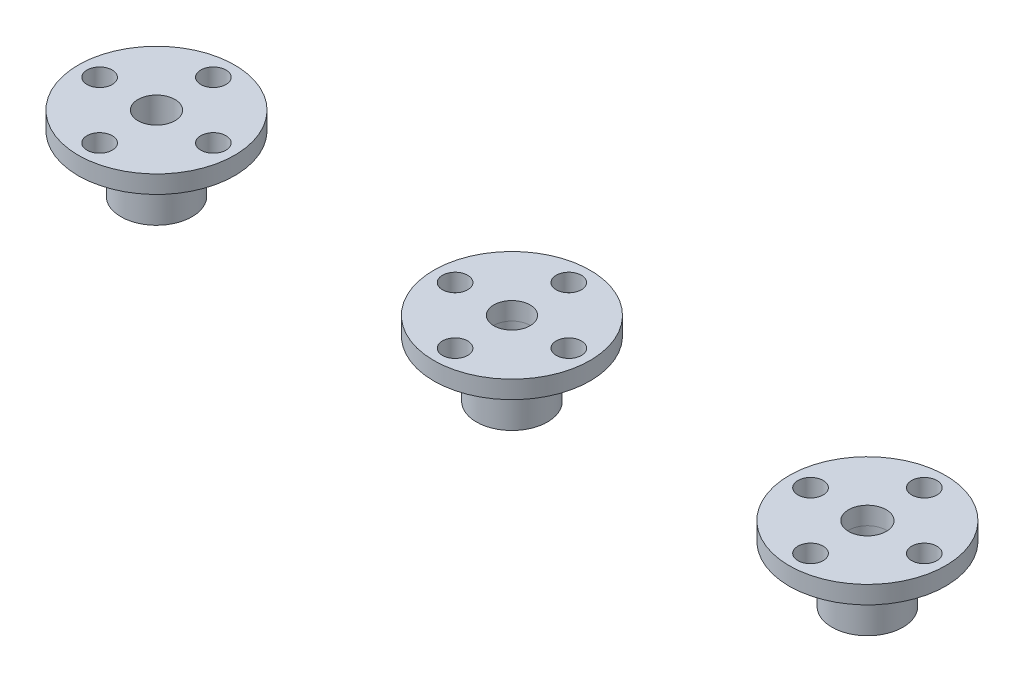
ISO-10303-21;
HEADER;
FILE_DESCRIPTION(('STEP AP214'),'2;1');
FILE_NAME('part.step','',(''),(''),'','','');
FILE_SCHEMA(('AUTOMOTIVE_DESIGN { 1 0 10303 214 1 1 1 1 }'));
ENDSEC;
DATA;
#1=APPLICATION_CONTEXT('core data for automotive mechanical design processes');
#2=APPLICATION_PROTOCOL_DEFINITION('international standard','automotive_design',2000,#1);
#3=PRODUCT_CONTEXT('',#1,'mechanical');
#4=PRODUCT('Part','Part','',(#3));
#5=PRODUCT_RELATED_PRODUCT_CATEGORY('part','',(#4));
#6=PRODUCT_DEFINITION_FORMATION('','',#4);
#7=PRODUCT_DEFINITION_CONTEXT('part definition',#1,'design');
#8=PRODUCT_DEFINITION('design','',#6,#7);
#9=PRODUCT_DEFINITION_SHAPE('','',#8);
#10=(LENGTH_UNIT() NAMED_UNIT(*) SI_UNIT(.MILLI.,.METRE.));
#11=(NAMED_UNIT(*) PLANE_ANGLE_UNIT() SI_UNIT($,.RADIAN.));
#12=(NAMED_UNIT(*) SI_UNIT($,.STERADIAN.) SOLID_ANGLE_UNIT());
#13=UNCERTAINTY_MEASURE_WITH_UNIT(LENGTH_MEASURE(1.E-05),#10,'distance_accuracy_value','');
#14=(GEOMETRIC_REPRESENTATION_CONTEXT(3) GLOBAL_UNCERTAINTY_ASSIGNED_CONTEXT((#13)) GLOBAL_UNIT_ASSIGNED_CONTEXT((#10,
#11,#12)) REPRESENTATION_CONTEXT('',''));
#15=CARTESIAN_POINT('',(0.,0.,0.));
#16=DIRECTION('',(0.,0.,1.));
#17=DIRECTION('',(1.,0.,0.));
#18=AXIS2_PLACEMENT_3D('',#15,#16,#17);
#19=CARTESIAN_POINT('',(50.,10.5,0.));
#20=DIRECTION('',(0.,1.,0.));
#21=DIRECTION('',(0.,0.,1.));
#22=AXIS2_PLACEMENT_3D('',#19,#20,#21);
#23=PLANE('',#22);
#24=CARTESIAN_POINT('',(50.0000000000002,10.5,8.));
#25=DIRECTION('',(0.,1.,0.));
#26=DIRECTION('',(0.,0.,1.));
#27=AXIS2_PLACEMENT_3D('',#24,#25,#26);
#28=CIRCLE('',#27,1.77500000000001);
#29=CARTESIAN_POINT('',(50.0000000000002,10.5,9.77500000000001));
#30=VERTEX_POINT('',#29);
#31=EDGE_CURVE('E74',#30,#30,#28,.T.);
#32=ORIENTED_EDGE('',*,*,#31,.F.);
#33=EDGE_LOOP('',(#32));
#34=FACE_BOUND('',#33,.T.);
#35=CARTESIAN_POINT('',(50.,10.5,-8.));
#36=DIRECTION('',(0.,1.,0.));
#37=DIRECTION('',(0.,0.,1.));
#38=AXIS2_PLACEMENT_3D('',#35,#36,#37);
#39=CIRCLE('',#38,1.775);
#40=CARTESIAN_POINT('',(50.,10.5,-6.225));
#41=VERTEX_POINT('',#40);
#42=EDGE_CURVE('E62',#41,#41,#39,.T.);
#43=ORIENTED_EDGE('',*,*,#42,.F.);
#44=EDGE_LOOP('',(#43));
#45=FACE_BOUND('',#44,.T.);
#46=CARTESIAN_POINT('',(50.,10.5,0.));
#47=DIRECTION('',(0.,1.,0.));
#48=DIRECTION('',(0.,0.,1.));
#49=AXIS2_PLACEMENT_3D('',#46,#47,#48);
#50=CIRCLE('',#49,11.);
#51=CARTESIAN_POINT('',(50.,10.5,11.));
#52=VERTEX_POINT('',#51);
#53=EDGE_CURVE('E11',#52,#52,#50,.T.);
#54=ORIENTED_EDGE('',*,*,#53,.T.);
#55=EDGE_LOOP('',(#54));
#56=FACE_BOUND('',#55,.T.);
#57=CARTESIAN_POINT('',(50.,10.5,0.));
#58=DIRECTION('',(0.,1.,0.));
#59=DIRECTION('',(0.,0.,1.));
#60=AXIS2_PLACEMENT_3D('',#57,#58,#59);
#61=CIRCLE('',#60,2.65);
#62=CARTESIAN_POINT('',(50.,10.5,2.65));
#63=VERTEX_POINT('',#62);
#64=EDGE_CURVE('E57',#63,#63,#61,.T.);
#65=ORIENTED_EDGE('',*,*,#64,.F.);
#66=EDGE_LOOP('',(#65));
#67=FACE_BOUND('',#66,.T.);
#68=CARTESIAN_POINT('',(58.0000000000001,10.5,0.));
#69=DIRECTION('',(0.,1.,0.));
#70=DIRECTION('',(0.,0.,1.));
#71=AXIS2_PLACEMENT_3D('',#68,#69,#70);
#72=CIRCLE('',#71,1.775);
#73=CARTESIAN_POINT('',(58.0000000000001,10.5,1.77499999999992));
#74=VERTEX_POINT('',#73);
#75=EDGE_CURVE('E68',#74,#74,#72,.T.);
#76=ORIENTED_EDGE('',*,*,#75,.F.);
#77=EDGE_LOOP('',(#76));
#78=FACE_BOUND('',#77,.T.);
#79=CARTESIAN_POINT('',(42.0000000000001,10.5,0.));
#80=DIRECTION('',(0.,1.,0.));
#81=DIRECTION('',(0.,0.,1.));
#82=AXIS2_PLACEMENT_3D('',#79,#80,#81);
#83=CIRCLE('',#82,1.775);
#84=CARTESIAN_POINT('',(42.0000000000001,10.5,1.77500000000003));
#85=VERTEX_POINT('',#84);
#86=EDGE_CURVE('E80',#85,#85,#83,.T.);
#87=ORIENTED_EDGE('',*,*,#86,.F.);
#88=EDGE_LOOP('',(#87));
#89=FACE_BOUND('',#88,.T.);
#90=ADVANCED_FACE('F46',(#34,#45,#56,#67,#78,#89),#23,.T.);
#91=CARTESIAN_POINT('',(50.,8.,0.));
#92=DIRECTION('',(0.,1.,0.));
#93=DIRECTION('',(0.,0.,1.));
#94=AXIS2_PLACEMENT_3D('',#91,#92,#93);
#95=PLANE('',#94);
#96=CARTESIAN_POINT('',(50.,8.,0.));
#97=DIRECTION('',(0.,1.,0.));
#98=DIRECTION('',(0.,0.,1.));
#99=AXIS2_PLACEMENT_3D('',#96,#97,#98);
#100=CIRCLE('',#99,11.);
#101=CARTESIAN_POINT('',(50.,8.,11.));
#102=VERTEX_POINT('',#101);
#103=EDGE_CURVE('E50',#102,#102,#100,.T.);
#104=ORIENTED_EDGE('',*,*,#103,.F.);
#105=EDGE_LOOP('',(#104));
#106=FACE_BOUND('',#105,.T.);
#107=CARTESIAN_POINT('',(50.,8.,0.));
#108=DIRECTION('',(0.,1.,0.));
#109=DIRECTION('',(0.,0.,1.));
#110=AXIS2_PLACEMENT_3D('',#107,#108,#109);
#111=CIRCLE('',#110,2.65);
#112=CARTESIAN_POINT('',(50.,8.,2.65));
#113=VERTEX_POINT('',#112);
#114=EDGE_CURVE('E59',#113,#113,#111,.T.);
#115=ORIENTED_EDGE('',*,*,#114,.T.);
#116=EDGE_LOOP('',(#115));
#117=FACE_BOUND('',#116,.T.);
#118=CARTESIAN_POINT('',(50.,8.,-8.));
#119=DIRECTION('',(0.,1.,0.));
#120=DIRECTION('',(0.,0.,1.));
#121=AXIS2_PLACEMENT_3D('',#118,#119,#120);
#122=CIRCLE('',#121,1.775);
#123=CARTESIAN_POINT('',(50.,8.,-6.225));
#124=VERTEX_POINT('',#123);
#125=EDGE_CURVE('E65',#124,#124,#122,.T.);
#126=ORIENTED_EDGE('',*,*,#125,.T.);
#127=EDGE_LOOP('',(#126));
#128=FACE_BOUND('',#127,.T.);
#129=CARTESIAN_POINT('',(58.0000000000001,8.,0.));
#130=DIRECTION('',(0.,1.,0.));
#131=DIRECTION('',(0.,0.,1.));
#132=AXIS2_PLACEMENT_3D('',#129,#130,#131);
#133=CIRCLE('',#132,1.775);
#134=CARTESIAN_POINT('',(58.0000000000001,8.,1.77499999999992));
#135=VERTEX_POINT('',#134);
#136=EDGE_CURVE('E71',#135,#135,#133,.T.);
#137=ORIENTED_EDGE('',*,*,#136,.T.);
#138=EDGE_LOOP('',(#137));
#139=FACE_BOUND('',#138,.T.);
#140=CARTESIAN_POINT('',(50.0000000000002,8.,8.));
#141=DIRECTION('',(0.,1.,0.));
#142=DIRECTION('',(0.,0.,1.));
#143=AXIS2_PLACEMENT_3D('',#140,#141,#142);
#144=CIRCLE('',#143,1.77500000000001);
#145=CARTESIAN_POINT('',(50.0000000000002,8.,9.77500000000001));
#146=VERTEX_POINT('',#145);
#147=EDGE_CURVE('E77',#146,#146,#144,.T.);
#148=ORIENTED_EDGE('',*,*,#147,.T.);
#149=EDGE_LOOP('',(#148));
#150=FACE_BOUND('',#149,.T.);
#151=CARTESIAN_POINT('',(42.0000000000001,8.,0.));
#152=DIRECTION('',(0.,1.,0.));
#153=DIRECTION('',(0.,0.,1.));
#154=AXIS2_PLACEMENT_3D('',#151,#152,#153);
#155=CIRCLE('',#154,1.775);
#156=CARTESIAN_POINT('',(42.0000000000001,8.,1.77500000000003));
#157=VERTEX_POINT('',#156);
#158=EDGE_CURVE('E83',#157,#157,#155,.T.);
#159=ORIENTED_EDGE('',*,*,#158,.T.);
#160=EDGE_LOOP('',(#159));
#161=FACE_BOUND('',#160,.T.);
#162=ADVANCED_FACE('F93',(#106,#117,#128,#139,#150,#161),#95,.F.);
#163=CARTESIAN_POINT('',(50.,10.5,0.));
#164=DIRECTION('',(0.,-1.,0.));
#165=DIRECTION('',(0.,0.,-1.));
#166=AXIS2_PLACEMENT_3D('',#163,#164,#165);
#167=CYLINDRICAL_SURFACE('',#166,11.);
#168=ORIENTED_EDGE('',*,*,#53,.F.);
#169=EDGE_LOOP('',(#168));
#170=FACE_BOUND('',#169,.T.);
#171=ORIENTED_EDGE('',*,*,#103,.T.);
#172=EDGE_LOOP('',(#171));
#173=FACE_BOUND('',#172,.T.);
#174=ADVANCED_FACE('F48',(#170,#173),#167,.T.);
#175=CARTESIAN_POINT('',(50.,10.5,0.));
#176=DIRECTION('',(0.,-1.,0.));
#177=DIRECTION('',(0.,0.,-1.));
#178=AXIS2_PLACEMENT_3D('',#175,#176,#177);
#179=CYLINDRICAL_SURFACE('',#178,2.65);
#180=ORIENTED_EDGE('',*,*,#64,.T.);
#181=EDGE_LOOP('',(#180));
#182=FACE_BOUND('',#181,.T.);
#183=ORIENTED_EDGE('',*,*,#114,.F.);
#184=EDGE_LOOP('',(#183));
#185=FACE_BOUND('',#184,.T.);
#186=ADVANCED_FACE('F103',(#182,#185),#179,.F.);
#187=CARTESIAN_POINT('',(50.,10.5,-8.));
#188=DIRECTION('',(0.,-1.,0.));
#189=DIRECTION('',(0.,0.,-1.));
#190=AXIS2_PLACEMENT_3D('',#187,#188,#189);
#191=CYLINDRICAL_SURFACE('',#190,1.775);
#192=ORIENTED_EDGE('',*,*,#42,.T.);
#193=EDGE_LOOP('',(#192));
#194=FACE_BOUND('',#193,.T.);
#195=ORIENTED_EDGE('',*,*,#125,.F.);
#196=EDGE_LOOP('',(#195));
#197=FACE_BOUND('',#196,.T.);
#198=ADVANCED_FACE('F106',(#194,#197),#191,.F.);
#199=CARTESIAN_POINT('',(58.0000000000001,10.5,0.));
#200=DIRECTION('',(0.,-1.,0.));
#201=DIRECTION('',(0.,0.,-1.));
#202=AXIS2_PLACEMENT_3D('',#199,#200,#201);
#203=CYLINDRICAL_SURFACE('',#202,1.775);
#204=ORIENTED_EDGE('',*,*,#75,.T.);
#205=EDGE_LOOP('',(#204));
#206=FACE_BOUND('',#205,.T.);
#207=ORIENTED_EDGE('',*,*,#136,.F.);
#208=EDGE_LOOP('',(#207));
#209=FACE_BOUND('',#208,.T.);
#210=ADVANCED_FACE('F110',(#206,#209),#203,.F.);
#211=CARTESIAN_POINT('',(50.0000000000002,10.5,8.));
#212=DIRECTION('',(0.,-1.,0.));
#213=DIRECTION('',(0.,0.,-1.));
#214=AXIS2_PLACEMENT_3D('',#211,#212,#213);
#215=CYLINDRICAL_SURFACE('',#214,1.77500000000001);
#216=ORIENTED_EDGE('',*,*,#31,.T.);
#217=EDGE_LOOP('',(#216));
#218=FACE_BOUND('',#217,.T.);
#219=ORIENTED_EDGE('',*,*,#147,.F.);
#220=EDGE_LOOP('',(#219));
#221=FACE_BOUND('',#220,.T.);
#222=ADVANCED_FACE('F114',(#218,#221),#215,.F.);
#223=CARTESIAN_POINT('',(42.0000000000001,10.5,0.));
#224=DIRECTION('',(0.,-1.,0.));
#225=DIRECTION('',(0.,0.,-1.));
#226=AXIS2_PLACEMENT_3D('',#223,#224,#225);
#227=CYLINDRICAL_SURFACE('',#226,1.775);
#228=ORIENTED_EDGE('',*,*,#86,.T.);
#229=EDGE_LOOP('',(#228));
#230=FACE_BOUND('',#229,.T.);
#231=ORIENTED_EDGE('',*,*,#158,.F.);
#232=EDGE_LOOP('',(#231));
#233=FACE_BOUND('',#232,.T.);
#234=ADVANCED_FACE('F89',(#230,#233),#227,.F.);
#235=CLOSED_SHELL('',(#90,#162,#174,#186,#198,#210,#222,#234));
#236=MANIFOLD_SOLID_BREP('B2',#235);
#237=CARTESIAN_POINT('',(0.,10.5,0.));
#238=DIRECTION('',(0.,1.,0.));
#239=DIRECTION('',(0.,0.,1.));
#240=AXIS2_PLACEMENT_3D('',#237,#238,#239);
#241=PLANE('',#240);
#242=CARTESIAN_POINT('',(4.51808198568511E-13,10.5,8.));
#243=DIRECTION('',(0.,1.,0.));
#244=DIRECTION('',(0.,0.,1.));
#245=AXIS2_PLACEMENT_3D('',#242,#243,#244);
#246=CIRCLE('',#245,1.77500000000049);
#247=CARTESIAN_POINT('',(4.51808198568511E-13,10.5,9.77500000000049));
#248=VERTEX_POINT('',#247);
#249=EDGE_CURVE('E228',#248,#248,#246,.T.);
#250=ORIENTED_EDGE('',*,*,#249,.F.);
#251=EDGE_LOOP('',(#250));
#252=FACE_BOUND('',#251,.T.);
#253=CARTESIAN_POINT('',(0.,10.5,-8.));
#254=DIRECTION('',(0.,1.,0.));
#255=DIRECTION('',(0.,0.,1.));
#256=AXIS2_PLACEMENT_3D('',#253,#254,#255);
#257=CIRCLE('',#256,1.775);
#258=CARTESIAN_POINT('',(0.,10.5,-6.225));
#259=VERTEX_POINT('',#258);
#260=EDGE_CURVE('E216',#259,#259,#257,.T.);
#261=ORIENTED_EDGE('',*,*,#260,.F.);
#262=EDGE_LOOP('',(#261));
#263=FACE_BOUND('',#262,.T.);
#264=CARTESIAN_POINT('',(0.,10.5,0.));
#265=DIRECTION('',(0.,1.,0.));
#266=DIRECTION('',(0.,0.,1.));
#267=AXIS2_PLACEMENT_3D('',#264,#265,#266);
#268=CIRCLE('',#267,11.);
#269=CARTESIAN_POINT('',(0.,10.5,11.));
#270=VERTEX_POINT('',#269);
#271=EDGE_CURVE('E45',#270,#270,#268,.T.);
#272=ORIENTED_EDGE('',*,*,#271,.T.);
#273=EDGE_LOOP('',(#272));
#274=FACE_BOUND('',#273,.T.);
#275=CARTESIAN_POINT('',(0.,10.5,0.));
#276=DIRECTION('',(0.,1.,0.));
#277=DIRECTION('',(0.,0.,1.));
#278=AXIS2_PLACEMENT_3D('',#275,#276,#277);
#279=CIRCLE('',#278,2.55);
#280=CARTESIAN_POINT('',(0.,10.5,2.55));
#281=VERTEX_POINT('',#280);
#282=EDGE_CURVE('E211',#281,#281,#279,.T.);
#283=ORIENTED_EDGE('',*,*,#282,.F.);
#284=EDGE_LOOP('',(#283));
#285=FACE_BOUND('',#284,.T.);
#286=CARTESIAN_POINT('',(8.00000000000023,10.5,-2.25904099284255E-13));
#287=DIRECTION('',(0.,1.,0.));
#288=DIRECTION('',(0.,0.,1.));
#289=AXIS2_PLACEMENT_3D('',#286,#287,#288);
#290=CIRCLE('',#289,1.77500000000018);
#291=CARTESIAN_POINT('',(8.00000000000023,10.5,1.77499999999995));
#292=VERTEX_POINT('',#291);
#293=EDGE_CURVE('E222',#292,#292,#290,.T.);
#294=ORIENTED_EDGE('',*,*,#293,.F.);
#295=EDGE_LOOP('',(#294));
#296=FACE_BOUND('',#295,.T.);
#297=CARTESIAN_POINT('',(-7.99999999999977,10.5,2.26883816723573E-13));
#298=DIRECTION('',(0.,1.,0.));
#299=DIRECTION('',(0.,0.,1.));
#300=AXIS2_PLACEMENT_3D('',#297,#298,#299);
#301=CIRCLE('',#300,1.77500000000036);
#302=CARTESIAN_POINT('',(-7.99999999999977,10.5,1.77500000000059));
#303=VERTEX_POINT('',#302);
#304=EDGE_CURVE('E234',#303,#303,#301,.T.);
#305=ORIENTED_EDGE('',*,*,#304,.F.);
#306=EDGE_LOOP('',(#305));
#307=FACE_BOUND('',#306,.T.);
#308=ADVANCED_FACE('F200',(#252,#263,#274,#285,#296,#307),#241,.T.);
#309=CARTESIAN_POINT('',(0.,8.,0.));
#310=DIRECTION('',(0.,1.,0.));
#311=DIRECTION('',(0.,0.,1.));
#312=AXIS2_PLACEMENT_3D('',#309,#310,#311);
#313=PLANE('',#312);
#314=CARTESIAN_POINT('',(0.,8.,0.));
#315=DIRECTION('',(0.,1.,0.));
#316=DIRECTION('',(0.,0.,1.));
#317=AXIS2_PLACEMENT_3D('',#314,#315,#316);
#318=CIRCLE('',#317,11.);
#319=CARTESIAN_POINT('',(0.,8.,11.));
#320=VERTEX_POINT('',#319);
#321=EDGE_CURVE('E204',#320,#320,#318,.T.);
#322=ORIENTED_EDGE('',*,*,#321,.F.);
#323=EDGE_LOOP('',(#322));
#324=FACE_BOUND('',#323,.T.);
#325=CARTESIAN_POINT('',(0.,8.,0.));
#326=DIRECTION('',(0.,1.,0.));
#327=DIRECTION('',(0.,0.,1.));
#328=AXIS2_PLACEMENT_3D('',#325,#326,#327);
#329=CIRCLE('',#328,2.55);
#330=CARTESIAN_POINT('',(0.,8.,2.55));
#331=VERTEX_POINT('',#330);
#332=EDGE_CURVE('E213',#331,#331,#329,.T.);
#333=ORIENTED_EDGE('',*,*,#332,.T.);
#334=EDGE_LOOP('',(#333));
#335=FACE_BOUND('',#334,.T.);
#336=CARTESIAN_POINT('',(0.,8.,-8.));
#337=DIRECTION('',(0.,1.,0.));
#338=DIRECTION('',(0.,0.,1.));
#339=AXIS2_PLACEMENT_3D('',#336,#337,#338);
#340=CIRCLE('',#339,1.775);
#341=CARTESIAN_POINT('',(0.,8.,-6.225));
#342=VERTEX_POINT('',#341);
#343=EDGE_CURVE('E219',#342,#342,#340,.T.);
#344=ORIENTED_EDGE('',*,*,#343,.T.);
#345=EDGE_LOOP('',(#344));
#346=FACE_BOUND('',#345,.T.);
#347=CARTESIAN_POINT('',(8.00000000000023,8.,-2.25904099284255E-13));
#348=DIRECTION('',(0.,1.,0.));
#349=DIRECTION('',(0.,0.,1.));
#350=AXIS2_PLACEMENT_3D('',#347,#348,#349);
#351=CIRCLE('',#350,1.77500000000018);
#352=CARTESIAN_POINT('',(8.00000000000023,8.,1.77499999999995));
#353=VERTEX_POINT('',#352);
#354=EDGE_CURVE('E225',#353,#353,#351,.T.);
#355=ORIENTED_EDGE('',*,*,#354,.T.);
#356=EDGE_LOOP('',(#355));
#357=FACE_BOUND('',#356,.T.);
#358=CARTESIAN_POINT('',(4.51808198568511E-13,8.,8.));
#359=DIRECTION('',(0.,1.,0.));
#360=DIRECTION('',(0.,0.,1.));
#361=AXIS2_PLACEMENT_3D('',#358,#359,#360);
#362=CIRCLE('',#361,1.77500000000049);
#363=CARTESIAN_POINT('',(4.51808198568511E-13,8.,9.77500000000049));
#364=VERTEX_POINT('',#363);
#365=EDGE_CURVE('E231',#364,#364,#362,.T.);
#366=ORIENTED_EDGE('',*,*,#365,.T.);
#367=EDGE_LOOP('',(#366));
#368=FACE_BOUND('',#367,.T.);
#369=CARTESIAN_POINT('',(-7.99999999999977,8.,2.26883816723573E-13));
#370=DIRECTION('',(0.,1.,0.));
#371=DIRECTION('',(0.,0.,1.));
#372=AXIS2_PLACEMENT_3D('',#369,#370,#371);
#373=CIRCLE('',#372,1.77500000000036);
#374=CARTESIAN_POINT('',(-7.99999999999977,8.,1.77500000000059));
#375=VERTEX_POINT('',#374);
#376=EDGE_CURVE('E237',#375,#375,#373,.T.);
#377=ORIENTED_EDGE('',*,*,#376,.T.);
#378=EDGE_LOOP('',(#377));
#379=FACE_BOUND('',#378,.T.);
#380=ADVANCED_FACE('F247',(#324,#335,#346,#357,#368,#379),#313,.F.);
#381=CARTESIAN_POINT('',(0.,10.5,0.));
#382=DIRECTION('',(0.,-1.,0.));
#383=DIRECTION('',(0.,0.,-1.));
#384=AXIS2_PLACEMENT_3D('',#381,#382,#383);
#385=CYLINDRICAL_SURFACE('',#384,11.);
#386=ORIENTED_EDGE('',*,*,#271,.F.);
#387=EDGE_LOOP('',(#386));
#388=FACE_BOUND('',#387,.T.);
#389=ORIENTED_EDGE('',*,*,#321,.T.);
#390=EDGE_LOOP('',(#389));
#391=FACE_BOUND('',#390,.T.);
#392=ADVANCED_FACE('F202',(#388,#391),#385,.T.);
#393=CARTESIAN_POINT('',(0.,10.5,0.));
#394=DIRECTION('',(0.,-1.,0.));
#395=DIRECTION('',(0.,0.,-1.));
#396=AXIS2_PLACEMENT_3D('',#393,#394,#395);
#397=CYLINDRICAL_SURFACE('',#396,2.55);
#398=ORIENTED_EDGE('',*,*,#282,.T.);
#399=EDGE_LOOP('',(#398));
#400=FACE_BOUND('',#399,.T.);
#401=ORIENTED_EDGE('',*,*,#332,.F.);
#402=EDGE_LOOP('',(#401));
#403=FACE_BOUND('',#402,.T.);
#404=ADVANCED_FACE('F257',(#400,#403),#397,.F.);
#405=CARTESIAN_POINT('',(0.,10.5,-8.));
#406=DIRECTION('',(0.,-1.,0.));
#407=DIRECTION('',(0.,0.,-1.));
#408=AXIS2_PLACEMENT_3D('',#405,#406,#407);
#409=CYLINDRICAL_SURFACE('',#408,1.775);
#410=ORIENTED_EDGE('',*,*,#260,.T.);
#411=EDGE_LOOP('',(#410));
#412=FACE_BOUND('',#411,.T.);
#413=ORIENTED_EDGE('',*,*,#343,.F.);
#414=EDGE_LOOP('',(#413));
#415=FACE_BOUND('',#414,.T.);
#416=ADVANCED_FACE('F260',(#412,#415),#409,.F.);
#417=CARTESIAN_POINT('',(8.00000000000023,10.5,-2.25904099284255E-13));
#418=DIRECTION('',(0.,-1.,0.));
#419=DIRECTION('',(0.,0.,-1.));
#420=AXIS2_PLACEMENT_3D('',#417,#418,#419);
#421=CYLINDRICAL_SURFACE('',#420,1.77500000000018);
#422=ORIENTED_EDGE('',*,*,#293,.T.);
#423=EDGE_LOOP('',(#422));
#424=FACE_BOUND('',#423,.T.);
#425=ORIENTED_EDGE('',*,*,#354,.F.);
#426=EDGE_LOOP('',(#425));
#427=FACE_BOUND('',#426,.T.);
#428=ADVANCED_FACE('F264',(#424,#427),#421,.F.);
#429=CARTESIAN_POINT('',(4.51808198568511E-13,10.5,8.));
#430=DIRECTION('',(0.,-1.,0.));
#431=DIRECTION('',(0.,0.,-1.));
#432=AXIS2_PLACEMENT_3D('',#429,#430,#431);
#433=CYLINDRICAL_SURFACE('',#432,1.77500000000049);
#434=ORIENTED_EDGE('',*,*,#249,.T.);
#435=EDGE_LOOP('',(#434));
#436=FACE_BOUND('',#435,.T.);
#437=ORIENTED_EDGE('',*,*,#365,.F.);
#438=EDGE_LOOP('',(#437));
#439=FACE_BOUND('',#438,.T.);
#440=ADVANCED_FACE('F268',(#436,#439),#433,.F.);
#441=CARTESIAN_POINT('',(-7.99999999999977,10.5,2.26883816723573E-13));
#442=DIRECTION('',(0.,-1.,0.));
#443=DIRECTION('',(0.,0.,-1.));
#444=AXIS2_PLACEMENT_3D('',#441,#442,#443);
#445=CYLINDRICAL_SURFACE('',#444,1.77500000000036);
#446=ORIENTED_EDGE('',*,*,#304,.T.);
#447=EDGE_LOOP('',(#446));
#448=FACE_BOUND('',#447,.T.);
#449=ORIENTED_EDGE('',*,*,#376,.F.);
#450=EDGE_LOOP('',(#449));
#451=FACE_BOUND('',#450,.T.);
#452=ADVANCED_FACE('F243',(#448,#451),#445,.F.);
#453=CLOSED_SHELL('',(#308,#380,#392,#404,#416,#428,#440,#452));
#454=MANIFOLD_SOLID_BREP('B6',#453);
#455=CARTESIAN_POINT('',(50.,8.,0.));
#456=DIRECTION('',(0.,1.,0.));
#457=DIRECTION('',(0.,0.,1.));
#458=AXIS2_PLACEMENT_3D('',#455,#456,#457);
#459=PLANE('',#458);
#460=CARTESIAN_POINT('',(50.,8.,0.));
#461=DIRECTION('',(0.,1.,0.));
#462=DIRECTION('',(0.,0.,1.));
#463=AXIS2_PLACEMENT_3D('',#460,#461,#462);
#464=CIRCLE('',#463,5.);
#465=CARTESIAN_POINT('',(50.,8.,5.));
#466=VERTEX_POINT('',#465);
#467=EDGE_CURVE('E199',#466,#466,#464,.T.);
#468=ORIENTED_EDGE('',*,*,#467,.T.);
#469=EDGE_LOOP('',(#468));
#470=FACE_BOUND('',#469,.T.);
#471=CARTESIAN_POINT('',(50.,8.,0.));
#472=DIRECTION('',(0.,1.,0.));
#473=DIRECTION('',(0.,0.,1.));
#474=AXIS2_PLACEMENT_3D('',#471,#472,#473);
#475=CIRCLE('',#474,2.65);
#476=CARTESIAN_POINT('',(50.,8.,2.65));
#477=VERTEX_POINT('',#476);
#478=EDGE_CURVE('E365',#477,#477,#475,.T.);
#479=ORIENTED_EDGE('',*,*,#478,.F.);
#480=EDGE_LOOP('',(#479));
#481=FACE_BOUND('',#480,.T.);
#482=ADVANCED_FACE('F354',(#470,#481),#459,.T.);
#483=CARTESIAN_POINT('',(50.,0.,0.));
#484=DIRECTION('',(0.,1.,0.));
#485=DIRECTION('',(0.,0.,1.));
#486=AXIS2_PLACEMENT_3D('',#483,#484,#485);
#487=PLANE('',#486);
#488=CARTESIAN_POINT('',(50.,0.,0.));
#489=DIRECTION('',(0.,1.,0.));
#490=DIRECTION('',(0.,0.,1.));
#491=AXIS2_PLACEMENT_3D('',#488,#489,#490);
#492=CIRCLE('',#491,5.);
#493=CARTESIAN_POINT('',(50.,0.,5.));
#494=VERTEX_POINT('',#493);
#495=EDGE_CURVE('E358',#494,#494,#492,.T.);
#496=ORIENTED_EDGE('',*,*,#495,.F.);
#497=EDGE_LOOP('',(#496));
#498=FACE_BOUND('',#497,.T.);
#499=CARTESIAN_POINT('',(50.,0.,0.));
#500=DIRECTION('',(0.,1.,0.));
#501=DIRECTION('',(0.,0.,1.));
#502=AXIS2_PLACEMENT_3D('',#499,#500,#501);
#503=CIRCLE('',#502,2.65);
#504=CARTESIAN_POINT('',(50.,0.,2.65));
#505=VERTEX_POINT('',#504);
#506=EDGE_CURVE('E367',#505,#505,#503,.T.);
#507=ORIENTED_EDGE('',*,*,#506,.T.);
#508=EDGE_LOOP('',(#507));
#509=FACE_BOUND('',#508,.T.);
#510=ADVANCED_FACE('F377',(#498,#509),#487,.F.);
#511=CARTESIAN_POINT('',(50.,8.,0.));
#512=DIRECTION('',(0.,-1.,0.));
#513=DIRECTION('',(0.,0.,-1.));
#514=AXIS2_PLACEMENT_3D('',#511,#512,#513);
#515=CYLINDRICAL_SURFACE('',#514,5.);
#516=ORIENTED_EDGE('',*,*,#467,.F.);
#517=EDGE_LOOP('',(#516));
#518=FACE_BOUND('',#517,.T.);
#519=ORIENTED_EDGE('',*,*,#495,.T.);
#520=EDGE_LOOP('',(#519));
#521=FACE_BOUND('',#520,.T.);
#522=ADVANCED_FACE('F356',(#518,#521),#515,.T.);
#523=CARTESIAN_POINT('',(50.,8.,0.));
#524=DIRECTION('',(0.,-1.,0.));
#525=DIRECTION('',(0.,0.,-1.));
#526=AXIS2_PLACEMENT_3D('',#523,#524,#525);
#527=CYLINDRICAL_SURFACE('',#526,2.65);
#528=ORIENTED_EDGE('',*,*,#478,.T.);
#529=EDGE_LOOP('',(#528));
#530=FACE_BOUND('',#529,.T.);
#531=ORIENTED_EDGE('',*,*,#506,.F.);
#532=EDGE_LOOP('',(#531));
#533=FACE_BOUND('',#532,.T.);
#534=ADVANCED_FACE('F373',(#530,#533),#527,.F.);
#535=CLOSED_SHELL('',(#482,#510,#522,#534));
#536=MANIFOLD_SOLID_BREP('B40',#535);
#537=CARTESIAN_POINT('',(-50.,0.,0.));
#538=DIRECTION('',(0.,1.,0.));
#539=DIRECTION('',(0.,0.,1.));
#540=AXIS2_PLACEMENT_3D('',#537,#538,#539);
#541=PLANE('',#540);
#542=CARTESIAN_POINT('',(-50.,0.,0.));
#543=DIRECTION('',(0.,1.,0.));
#544=DIRECTION('',(0.,0.,1.));
#545=AXIS2_PLACEMENT_3D('',#542,#543,#544);
#546=CIRCLE('',#545,5.);
#547=CARTESIAN_POINT('',(-50.,0.,5.));
#548=VERTEX_POINT('',#547);
#549=EDGE_CURVE('E427',#548,#548,#546,.T.);
#550=ORIENTED_EDGE('',*,*,#549,.F.);
#551=EDGE_LOOP('',(#550));
#552=FACE_BOUND('',#551,.T.);
#553=CARTESIAN_POINT('',(-50.,0.,0.));
#554=DIRECTION('',(0.,1.,0.));
#555=DIRECTION('',(0.,0.,1.));
#556=AXIS2_PLACEMENT_3D('',#553,#554,#555);
#557=CIRCLE('',#556,2.6);
#558=CARTESIAN_POINT('',(-50.,0.,2.6));
#559=VERTEX_POINT('',#558);
#560=EDGE_CURVE('E436',#559,#559,#557,.T.);
#561=ORIENTED_EDGE('',*,*,#560,.T.);
#562=EDGE_LOOP('',(#561));
#563=FACE_BOUND('',#562,.T.);
#564=ADVANCED_FACE('F423',(#552,#563),#541,.F.);
#565=CARTESIAN_POINT('',(-50.,8.,0.));
#566=DIRECTION('',(0.,-1.,0.));
#567=DIRECTION('',(0.,0.,-1.));
#568=AXIS2_PLACEMENT_3D('',#565,#566,#567);
#569=CYLINDRICAL_SURFACE('',#568,5.);
#570=CARTESIAN_POINT('',(-50.,8.,0.));
#571=DIRECTION('',(0.,1.,0.));
#572=DIRECTION('',(0.,0.,1.));
#573=AXIS2_PLACEMENT_3D('',#570,#571,#572);
#574=CIRCLE('',#573,5.);
#575=CARTESIAN_POINT('',(-50.,8.,5.));
#576=VERTEX_POINT('',#575);
#577=EDGE_CURVE('E353',#576,#576,#574,.T.);
#578=ORIENTED_EDGE('',*,*,#577,.F.);
#579=EDGE_LOOP('',(#578));
#580=FACE_BOUND('',#579,.T.);
#581=ORIENTED_EDGE('',*,*,#549,.T.);
#582=EDGE_LOOP('',(#581));
#583=FACE_BOUND('',#582,.T.);
#584=ADVANCED_FACE('F425',(#580,#583),#569,.T.);
#585=CARTESIAN_POINT('',(-50.,8.,0.));
#586=DIRECTION('',(0.,-1.,0.));
#587=DIRECTION('',(0.,0.,-1.));
#588=AXIS2_PLACEMENT_3D('',#585,#586,#587);
#589=CYLINDRICAL_SURFACE('',#588,2.6);
#590=ORIENTED_EDGE('',*,*,#560,.F.);
#591=EDGE_LOOP('',(#590));
#592=FACE_BOUND('',#591,.T.);
#593=CARTESIAN_POINT('',(-50.,10.5,0.));
#594=DIRECTION('',(0.,1.,0.));
#595=DIRECTION('',(0.,0.,1.));
#596=AXIS2_PLACEMENT_3D('',#593,#594,#595);
#597=CIRCLE('',#596,2.6);
#598=CARTESIAN_POINT('',(-50.,10.5,2.6));
#599=VERTEX_POINT('',#598);
#600=EDGE_CURVE('E446',#599,#599,#597,.T.);
#601=ORIENTED_EDGE('',*,*,#600,.T.);
#602=EDGE_LOOP('',(#601));
#603=FACE_BOUND('',#602,.T.);
#604=ADVANCED_FACE('F492',(#592,#603),#589,.F.);
#605=CARTESIAN_POINT('',(-50.,10.5,0.));
#606=DIRECTION('',(0.,1.,0.));
#607=DIRECTION('',(0.,0.,1.));
#608=AXIS2_PLACEMENT_3D('',#605,#606,#607);
#609=PLANE('',#608);
#610=CARTESIAN_POINT('',(-50.,10.5,8.));
#611=DIRECTION('',(0.,1.,0.));
#612=DIRECTION('',(0.,0.,1.));
#613=AXIS2_PLACEMENT_3D('',#610,#611,#612);
#614=CIRCLE('',#613,1.775);
#615=CARTESIAN_POINT('',(-50.,10.5,9.775));
#616=VERTEX_POINT('',#615);
#617=EDGE_CURVE('E466',#616,#616,#614,.T.);
#618=ORIENTED_EDGE('',*,*,#617,.F.);
#619=EDGE_LOOP('',(#618));
#620=FACE_BOUND('',#619,.T.);
#621=CARTESIAN_POINT('',(-50.,10.5,-8.));
#622=DIRECTION('',(0.,1.,0.));
#623=DIRECTION('',(0.,0.,1.));
#624=AXIS2_PLACEMENT_3D('',#621,#622,#623);
#625=CIRCLE('',#624,1.775);
#626=CARTESIAN_POINT('',(-50.,10.5,-6.225));
#627=VERTEX_POINT('',#626);
#628=EDGE_CURVE('E453',#627,#627,#625,.T.);
#629=ORIENTED_EDGE('',*,*,#628,.F.);
#630=EDGE_LOOP('',(#629));
#631=FACE_BOUND('',#630,.T.);
#632=CARTESIAN_POINT('',(-50.,10.5,0.));
#633=DIRECTION('',(0.,1.,0.));
#634=DIRECTION('',(0.,0.,1.));
#635=AXIS2_PLACEMENT_3D('',#632,#633,#634);
#636=CIRCLE('',#635,11.);
#637=CARTESIAN_POINT('',(-50.,10.5,11.));
#638=VERTEX_POINT('',#637);
#639=EDGE_CURVE('E441',#638,#638,#636,.T.);
#640=ORIENTED_EDGE('',*,*,#639,.T.);
#641=EDGE_LOOP('',(#640));
#642=FACE_BOUND('',#641,.T.);
#643=ORIENTED_EDGE('',*,*,#600,.F.);
#644=EDGE_LOOP('',(#643));
#645=FACE_BOUND('',#644,.T.);
#646=CARTESIAN_POINT('',(-42.,10.5,0.));
#647=DIRECTION('',(0.,1.,0.));
#648=DIRECTION('',(0.,0.,1.));
#649=AXIS2_PLACEMENT_3D('',#646,#647,#648);
#650=CIRCLE('',#649,1.775);
#651=CARTESIAN_POINT('',(-42.,10.5,1.775));
#652=VERTEX_POINT('',#651);
#653=EDGE_CURVE('E458',#652,#652,#650,.T.);
#654=ORIENTED_EDGE('',*,*,#653,.F.);
#655=EDGE_LOOP('',(#654));
#656=FACE_BOUND('',#655,.T.);
#657=CARTESIAN_POINT('',(-58.,10.5,0.));
#658=DIRECTION('',(0.,1.,0.));
#659=DIRECTION('',(0.,0.,1.));
#660=AXIS2_PLACEMENT_3D('',#657,#658,#659);
#661=CIRCLE('',#660,1.775);
#662=CARTESIAN_POINT('',(-58.,10.5,1.775));
#663=VERTEX_POINT('',#662);
#664=EDGE_CURVE('E474',#663,#663,#661,.T.);
#665=ORIENTED_EDGE('',*,*,#664,.F.);
#666=EDGE_LOOP('',(#665));
#667=FACE_BOUND('',#666,.T.);
#668=ADVANCED_FACE('F489',(#620,#631,#642,#645,#656,#667),#609,.T.);
#669=CARTESIAN_POINT('',(-50.,8.,0.));
#670=DIRECTION('',(0.,1.,0.));
#671=DIRECTION('',(0.,0.,1.));
#672=AXIS2_PLACEMENT_3D('',#669,#670,#671);
#673=PLANE('',#672);
#674=ORIENTED_EDGE('',*,*,#577,.T.);
#675=EDGE_LOOP('',(#674));
#676=FACE_BOUND('',#675,.T.);
#677=CARTESIAN_POINT('',(-50.,8.,0.));
#678=DIRECTION('',(0.,1.,0.));
#679=DIRECTION('',(0.,0.,1.));
#680=AXIS2_PLACEMENT_3D('',#677,#678,#679);
#681=CIRCLE('',#680,11.);
#682=CARTESIAN_POINT('',(-50.,8.,11.));
#683=VERTEX_POINT('',#682);
#684=EDGE_CURVE('E442',#683,#683,#681,.T.);
#685=ORIENTED_EDGE('',*,*,#684,.F.);
#686=EDGE_LOOP('',(#685));
#687=FACE_BOUND('',#686,.T.);
#688=CARTESIAN_POINT('',(-50.,8.,-8.));
#689=DIRECTION('',(0.,1.,0.));
#690=DIRECTION('',(0.,0.,1.));
#691=AXIS2_PLACEMENT_3D('',#688,#689,#690);
#692=CIRCLE('',#691,1.775);
#693=CARTESIAN_POINT('',(-50.,8.,-6.225));
#694=VERTEX_POINT('',#693);
#695=EDGE_CURVE('E454',#694,#694,#692,.T.);
#696=ORIENTED_EDGE('',*,*,#695,.T.);
#697=EDGE_LOOP('',(#696));
#698=FACE_BOUND('',#697,.T.);
#699=CARTESIAN_POINT('',(-42.,8.,0.));
#700=DIRECTION('',(0.,1.,0.));
#701=DIRECTION('',(0.,0.,1.));
#702=AXIS2_PLACEMENT_3D('',#699,#700,#701);
#703=CIRCLE('',#702,1.775);
#704=CARTESIAN_POINT('',(-42.,8.,1.775));
#705=VERTEX_POINT('',#704);
#706=EDGE_CURVE('E462',#705,#705,#703,.T.);
#707=ORIENTED_EDGE('',*,*,#706,.T.);
#708=EDGE_LOOP('',(#707));
#709=FACE_BOUND('',#708,.T.);
#710=CARTESIAN_POINT('',(-50.,8.,8.));
#711=DIRECTION('',(0.,1.,0.));
#712=DIRECTION('',(0.,0.,1.));
#713=AXIS2_PLACEMENT_3D('',#710,#711,#712);
#714=CIRCLE('',#713,1.775);
#715=CARTESIAN_POINT('',(-50.,8.,9.775));
#716=VERTEX_POINT('',#715);
#717=EDGE_CURVE('E470',#716,#716,#714,.T.);
#718=ORIENTED_EDGE('',*,*,#717,.T.);
#719=EDGE_LOOP('',(#718));
#720=FACE_BOUND('',#719,.T.);
#721=CARTESIAN_POINT('',(-58.,8.,0.));
#722=DIRECTION('',(0.,1.,0.));
#723=DIRECTION('',(0.,0.,1.));
#724=AXIS2_PLACEMENT_3D('',#721,#722,#723);
#725=CIRCLE('',#724,1.775);
#726=CARTESIAN_POINT('',(-58.,8.,1.775));
#727=VERTEX_POINT('',#726);
#728=EDGE_CURVE('E478',#727,#727,#725,.T.);
#729=ORIENTED_EDGE('',*,*,#728,.T.);
#730=EDGE_LOOP('',(#729));
#731=FACE_BOUND('',#730,.T.);
#732=ADVANCED_FACE('F491',(#676,#687,#698,#709,#720,#731),#673,.F.);
#733=CARTESIAN_POINT('',(-50.,10.5,0.));
#734=DIRECTION('',(0.,-1.,0.));
#735=DIRECTION('',(0.,0.,-1.));
#736=AXIS2_PLACEMENT_3D('',#733,#734,#735);
#737=CYLINDRICAL_SURFACE('',#736,11.);
#738=ORIENTED_EDGE('',*,*,#639,.F.);
#739=EDGE_LOOP('',(#738));
#740=FACE_BOUND('',#739,.T.);
#741=ORIENTED_EDGE('',*,*,#684,.T.);
#742=EDGE_LOOP('',(#741));
#743=FACE_BOUND('',#742,.T.);
#744=ADVANCED_FACE('F499',(#740,#743),#737,.T.);
#745=CARTESIAN_POINT('',(-50.,10.5,-8.));
#746=DIRECTION('',(0.,-1.,0.));
#747=DIRECTION('',(0.,0.,-1.));
#748=AXIS2_PLACEMENT_3D('',#745,#746,#747);
#749=CYLINDRICAL_SURFACE('',#748,1.775);
#750=ORIENTED_EDGE('',*,*,#628,.T.);
#751=EDGE_LOOP('',(#750));
#752=FACE_BOUND('',#751,.T.);
#753=ORIENTED_EDGE('',*,*,#695,.F.);
#754=EDGE_LOOP('',(#753));
#755=FACE_BOUND('',#754,.T.);
#756=ADVANCED_FACE('F516',(#752,#755),#749,.F.);
#757=CARTESIAN_POINT('',(-42.,10.5,0.));
#758=DIRECTION('',(0.,-1.,0.));
#759=DIRECTION('',(0.,0.,-1.));
#760=AXIS2_PLACEMENT_3D('',#757,#758,#759);
#761=CYLINDRICAL_SURFACE('',#760,1.775);
#762=ORIENTED_EDGE('',*,*,#653,.T.);
#763=EDGE_LOOP('',(#762));
#764=FACE_BOUND('',#763,.T.);
#765=ORIENTED_EDGE('',*,*,#706,.F.);
#766=EDGE_LOOP('',(#765));
#767=FACE_BOUND('',#766,.T.);
#768=ADVANCED_FACE('F521',(#764,#767),#761,.F.);
#769=CARTESIAN_POINT('',(-50.,10.5,8.));
#770=DIRECTION('',(0.,-1.,0.));
#771=DIRECTION('',(0.,0.,-1.));
#772=AXIS2_PLACEMENT_3D('',#769,#770,#771);
#773=CYLINDRICAL_SURFACE('',#772,1.775);
#774=ORIENTED_EDGE('',*,*,#617,.T.);
#775=EDGE_LOOP('',(#774));
#776=FACE_BOUND('',#775,.T.);
#777=ORIENTED_EDGE('',*,*,#717,.F.);
#778=EDGE_LOOP('',(#777));
#779=FACE_BOUND('',#778,.T.);
#780=ADVANCED_FACE('F536',(#776,#779),#773,.F.);
#781=CARTESIAN_POINT('',(-58.,10.5,0.));
#782=DIRECTION('',(0.,-1.,0.));
#783=DIRECTION('',(0.,0.,-1.));
#784=AXIS2_PLACEMENT_3D('',#781,#782,#783);
#785=CYLINDRICAL_SURFACE('',#784,1.775);
#786=ORIENTED_EDGE('',*,*,#664,.T.);
#787=EDGE_LOOP('',(#786));
#788=FACE_BOUND('',#787,.T.);
#789=ORIENTED_EDGE('',*,*,#728,.F.);
#790=EDGE_LOOP('',(#789));
#791=FACE_BOUND('',#790,.T.);
#792=ADVANCED_FACE('F486',(#788,#791),#785,.F.);
#793=CLOSED_SHELL('',(#564,#584,#604,#668,#732,#744,#756,#768,#780,#792));
#794=MANIFOLD_SOLID_BREP('B194',#793);
#795=CARTESIAN_POINT('',(0.,8.,0.));
#796=DIRECTION('',(0.,1.,0.));
#797=DIRECTION('',(0.,0.,1.));
#798=AXIS2_PLACEMENT_3D('',#795,#796,#797);
#799=PLANE('',#798);
#800=CARTESIAN_POINT('',(0.,8.,0.));
#801=DIRECTION('',(0.,1.,0.));
#802=DIRECTION('',(0.,0.,1.));
#803=AXIS2_PLACEMENT_3D('',#800,#801,#802);
#804=CIRCLE('',#803,5.);
#805=CARTESIAN_POINT('',(0.,8.,5.));
#806=VERTEX_POINT('',#805);
#807=EDGE_CURVE('E422',#806,#806,#804,.T.);
#808=ORIENTED_EDGE('',*,*,#807,.T.);
#809=EDGE_LOOP('',(#808));
#810=FACE_BOUND('',#809,.T.);
#811=CARTESIAN_POINT('',(0.,8.,0.));
#812=DIRECTION('',(0.,1.,0.));
#813=DIRECTION('',(0.,0.,1.));
#814=AXIS2_PLACEMENT_3D('',#811,#812,#813);
#815=CIRCLE('',#814,2.55);
#816=CARTESIAN_POINT('',(0.,8.,2.55));
#817=VERTEX_POINT('',#816);
#818=EDGE_CURVE('E627',#817,#817,#815,.T.);
#819=ORIENTED_EDGE('',*,*,#818,.F.);
#820=EDGE_LOOP('',(#819));
#821=FACE_BOUND('',#820,.T.);
#822=ADVANCED_FACE('F616',(#810,#821),#799,.T.);
#823=CARTESIAN_POINT('',(0.,0.,0.));
#824=DIRECTION('',(0.,1.,0.));
#825=DIRECTION('',(0.,0.,1.));
#826=AXIS2_PLACEMENT_3D('',#823,#824,#825);
#827=PLANE('',#826);
#828=CARTESIAN_POINT('',(0.,0.,0.));
#829=DIRECTION('',(0.,1.,0.));
#830=DIRECTION('',(0.,0.,1.));
#831=AXIS2_PLACEMENT_3D('',#828,#829,#830);
#832=CIRCLE('',#831,5.);
#833=CARTESIAN_POINT('',(0.,0.,5.));
#834=VERTEX_POINT('',#833);
#835=EDGE_CURVE('E620',#834,#834,#832,.T.);
#836=ORIENTED_EDGE('',*,*,#835,.F.);
#837=EDGE_LOOP('',(#836));
#838=FACE_BOUND('',#837,.T.);
#839=CARTESIAN_POINT('',(0.,0.,0.));
#840=DIRECTION('',(0.,1.,0.));
#841=DIRECTION('',(0.,0.,1.));
#842=AXIS2_PLACEMENT_3D('',#839,#840,#841);
#843=CIRCLE('',#842,2.55);
#844=CARTESIAN_POINT('',(0.,0.,2.55));
#845=VERTEX_POINT('',#844);
#846=EDGE_CURVE('E629',#845,#845,#843,.T.);
#847=ORIENTED_EDGE('',*,*,#846,.T.);
#848=EDGE_LOOP('',(#847));
#849=FACE_BOUND('',#848,.T.);
#850=ADVANCED_FACE('F639',(#838,#849),#827,.F.);
#851=CARTESIAN_POINT('',(0.,8.,0.));
#852=DIRECTION('',(0.,-1.,0.));
#853=DIRECTION('',(0.,0.,-1.));
#854=AXIS2_PLACEMENT_3D('',#851,#852,#853);
#855=CYLINDRICAL_SURFACE('',#854,5.);
#856=ORIENTED_EDGE('',*,*,#807,.F.);
#857=EDGE_LOOP('',(#856));
#858=FACE_BOUND('',#857,.T.);
#859=ORIENTED_EDGE('',*,*,#835,.T.);
#860=EDGE_LOOP('',(#859));
#861=FACE_BOUND('',#860,.T.);
#862=ADVANCED_FACE('F618',(#858,#861),#855,.T.);
#863=CARTESIAN_POINT('',(0.,8.,0.));
#864=DIRECTION('',(0.,-1.,0.));
#865=DIRECTION('',(0.,0.,-1.));
#866=AXIS2_PLACEMENT_3D('',#863,#864,#865);
#867=CYLINDRICAL_SURFACE('',#866,2.55);
#868=ORIENTED_EDGE('',*,*,#818,.T.);
#869=EDGE_LOOP('',(#868));
#870=FACE_BOUND('',#869,.T.);
#871=ORIENTED_EDGE('',*,*,#846,.F.);
#872=EDGE_LOOP('',(#871));
#873=FACE_BOUND('',#872,.T.);
#874=ADVANCED_FACE('F635',(#870,#873),#867,.F.);
#875=CLOSED_SHELL('',(#822,#850,#862,#874));
#876=MANIFOLD_SOLID_BREP('B348',#875);
#877=ADVANCED_BREP_SHAPE_REPRESENTATION('',(#18,#236,#454,#536,#794,#876),#14);
#878=SHAPE_DEFINITION_REPRESENTATION(#9,#877);
ENDSEC;
END-ISO-10303-21;
